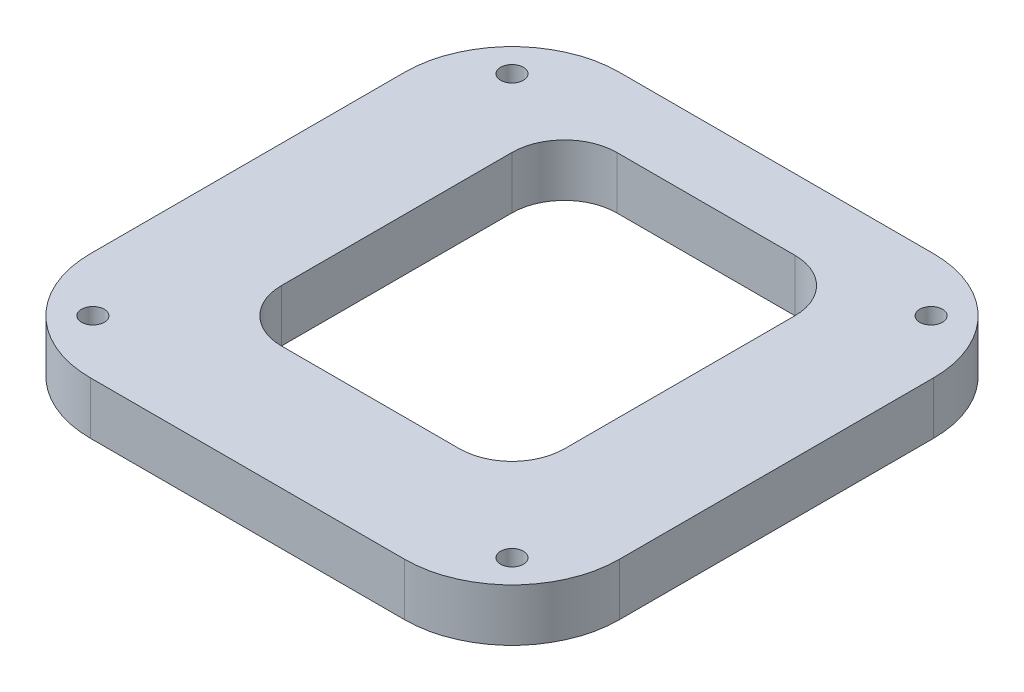
ISO-10303-21;
HEADER;
FILE_DESCRIPTION(('STEP AP214'),'2;1');
FILE_NAME('part.step','',(''),(''),'','','');
FILE_SCHEMA(('AUTOMOTIVE_DESIGN { 1 0 10303 214 1 1 1 1 }'));
ENDSEC;
DATA;
#1=APPLICATION_CONTEXT('core data for automotive mechanical design processes');
#2=APPLICATION_PROTOCOL_DEFINITION('international standard','automotive_design',2000,#1);
#3=PRODUCT_CONTEXT('',#1,'mechanical');
#4=PRODUCT('Part','Part','',(#3));
#5=PRODUCT_RELATED_PRODUCT_CATEGORY('part','',(#4));
#6=PRODUCT_DEFINITION_FORMATION('','',#4);
#7=PRODUCT_DEFINITION_CONTEXT('part definition',#1,'design');
#8=PRODUCT_DEFINITION('design','',#6,#7);
#9=PRODUCT_DEFINITION_SHAPE('','',#8);
#10=(LENGTH_UNIT() NAMED_UNIT(*) SI_UNIT(.MILLI.,.METRE.));
#11=(NAMED_UNIT(*) PLANE_ANGLE_UNIT() SI_UNIT($,.RADIAN.));
#12=(NAMED_UNIT(*) SI_UNIT($,.STERADIAN.) SOLID_ANGLE_UNIT());
#13=UNCERTAINTY_MEASURE_WITH_UNIT(LENGTH_MEASURE(1.E-05),#10,'distance_accuracy_value','');
#14=(GEOMETRIC_REPRESENTATION_CONTEXT(3) GLOBAL_UNCERTAINTY_ASSIGNED_CONTEXT((#13)) GLOBAL_UNIT_ASSIGNED_CONTEXT((#10,
#11,#12)) REPRESENTATION_CONTEXT('',''));
#15=CARTESIAN_POINT('',(0.,0.,0.));
#16=DIRECTION('',(0.,0.,1.));
#17=DIRECTION('',(1.,0.,0.));
#18=AXIS2_PLACEMENT_3D('',#15,#16,#17);
#19=CARTESIAN_POINT('',(0.,10.,0.));
#20=DIRECTION('',(0.,1.,0.));
#21=DIRECTION('',(0.,0.,1.));
#22=AXIS2_PLACEMENT_3D('',#19,#20,#21);
#23=PLANE('',#22);
#24=CARTESIAN_POINT('',(40.,10.,-40.));
#25=DIRECTION('',(0.,1.,0.));
#26=DIRECTION('',(0.,0.,1.));
#27=AXIS2_PLACEMENT_3D('',#24,#25,#26);
#28=CIRCLE('',#27,2.166);
#29=CARTESIAN_POINT('',(40.,10.,-37.834));
#30=VERTEX_POINT('',#29);
#31=EDGE_CURVE('E557',#30,#30,#28,.T.);
#32=ORIENTED_EDGE('',*,*,#31,.F.);
#33=EDGE_LOOP('',(#32));
#34=FACE_BOUND('',#33,.T.);
#35=CARTESIAN_POINT('',(-40.,10.,40.));
#36=DIRECTION('',(0.,1.,0.));
#37=DIRECTION('',(0.,0.,1.));
#38=AXIS2_PLACEMENT_3D('',#35,#36,#37);
#39=CIRCLE('',#38,2.166);
#40=CARTESIAN_POINT('',(-40.,10.,42.166));
#41=VERTEX_POINT('',#40);
#42=EDGE_CURVE('E562',#41,#41,#39,.T.);
#43=ORIENTED_EDGE('',*,*,#42,.F.);
#44=EDGE_LOOP('',(#43));
#45=FACE_BOUND('',#44,.T.);
#46=CARTESIAN_POINT('',(40.,10.,40.));
#47=DIRECTION('',(0.,1.,0.));
#48=DIRECTION('',(0.,0.,1.));
#49=AXIS2_PLACEMENT_3D('',#46,#47,#48);
#50=CIRCLE('',#49,2.166);
#51=CARTESIAN_POINT('',(40.,10.,42.166));
#52=VERTEX_POINT('',#51);
#53=EDGE_CURVE('E573',#52,#52,#50,.T.);
#54=ORIENTED_EDGE('',*,*,#53,.F.);
#55=EDGE_LOOP('',(#54));
#56=FACE_BOUND('',#55,.T.);
#57=CARTESIAN_POINT('',(-40.,10.,-40.));
#58=DIRECTION('',(0.,1.,0.));
#59=DIRECTION('',(0.,0.,1.));
#60=AXIS2_PLACEMENT_3D('',#57,#58,#59);
#61=CIRCLE('',#60,2.166);
#62=CARTESIAN_POINT('',(-40.,10.,-37.834));
#63=VERTEX_POINT('',#62);
#64=EDGE_CURVE('E558',#63,#63,#61,.T.);
#65=ORIENTED_EDGE('',*,*,#64,.F.);
#66=EDGE_LOOP('',(#65));
#67=FACE_BOUND('',#66,.T.);
#68=DIRECTION('',(-1.,0.,0.));
#69=VECTOR('',#68,1.);
#70=CARTESIAN_POINT('',(50.5,10.,-50.5));
#71=LINE('',#70,#69);
#72=CARTESIAN_POINT('',(30.,10.,-50.5));
#73=VERTEX_POINT('',#72);
#74=CARTESIAN_POINT('',(-30.,10.,-50.5));
#75=VERTEX_POINT('',#74);
#76=EDGE_CURVE('E187',#73,#75,#71,.T.);
#77=ORIENTED_EDGE('',*,*,#76,.T.);
#78=CARTESIAN_POINT('',(-30.,10.,-30.));
#79=DIRECTION('',(0.,1.,0.));
#80=DIRECTION('',(0.,0.,1.));
#81=AXIS2_PLACEMENT_3D('',#78,#79,#80);
#82=CIRCLE('',#81,20.5);
#83=CARTESIAN_POINT('',(-50.5,10.,-30.));
#84=VERTEX_POINT('',#83);
#85=EDGE_CURVE('E208',#75,#84,#82,.T.);
#86=ORIENTED_EDGE('',*,*,#85,.T.);
#87=DIRECTION('',(0.,0.,1.));
#88=VECTOR('',#87,1.);
#89=CARTESIAN_POINT('',(-50.5,10.,50.5));
#90=LINE('',#89,#88);
#91=CARTESIAN_POINT('',(-50.5,10.,30.));
#92=VERTEX_POINT('',#91);
#93=EDGE_CURVE('E171',#84,#92,#90,.T.);
#94=ORIENTED_EDGE('',*,*,#93,.T.);
#95=CARTESIAN_POINT('',(-30.,10.,30.));
#96=DIRECTION('',(0.,1.,0.));
#97=DIRECTION('',(0.,0.,1.));
#98=AXIS2_PLACEMENT_3D('',#95,#96,#97);
#99=CIRCLE('',#98,20.5);
#100=CARTESIAN_POINT('',(-30.,10.,50.5));
#101=VERTEX_POINT('',#100);
#102=EDGE_CURVE('E206',#92,#101,#99,.T.);
#103=ORIENTED_EDGE('',*,*,#102,.T.);
#104=DIRECTION('',(1.,0.,0.));
#105=VECTOR('',#104,1.);
#106=CARTESIAN_POINT('',(50.5,10.,50.5));
#107=LINE('',#106,#105);
#108=CARTESIAN_POINT('',(30.,10.,50.5));
#109=VERTEX_POINT('',#108);
#110=EDGE_CURVE('E286',#101,#109,#107,.T.);
#111=ORIENTED_EDGE('',*,*,#110,.T.);
#112=CARTESIAN_POINT('',(30.,10.,30.));
#113=DIRECTION('',(0.,1.,0.));
#114=DIRECTION('',(0.,0.,1.));
#115=AXIS2_PLACEMENT_3D('',#112,#113,#114);
#116=CIRCLE('',#115,20.5);
#117=CARTESIAN_POINT('',(50.5,10.,30.));
#118=VERTEX_POINT('',#117);
#119=EDGE_CURVE('E202',#109,#118,#116,.T.);
#120=ORIENTED_EDGE('',*,*,#119,.T.);
#121=DIRECTION('',(0.,0.,-1.));
#122=VECTOR('',#121,1.);
#123=CARTESIAN_POINT('',(50.5,10.,50.5));
#124=LINE('',#123,#122);
#125=CARTESIAN_POINT('',(50.5,10.,-30.));
#126=VERTEX_POINT('',#125);
#127=EDGE_CURVE('E288',#118,#126,#124,.T.);
#128=ORIENTED_EDGE('',*,*,#127,.T.);
#129=CARTESIAN_POINT('',(30.,10.,-30.));
#130=DIRECTION('',(0.,1.,0.));
#131=DIRECTION('',(0.,0.,1.));
#132=AXIS2_PLACEMENT_3D('',#129,#130,#131);
#133=CIRCLE('',#132,20.5);
#134=EDGE_CURVE('E204',#126,#73,#133,.T.);
#135=ORIENTED_EDGE('',*,*,#134,.T.);
#136=EDGE_LOOP('',(#77,#86,#94,#103,#111,#120,#128,#135));
#137=FACE_BOUND('',#136,.T.);
#138=DIRECTION('',(1.,0.,0.));
#139=VECTOR('',#138,1.);
#140=CARTESIAN_POINT('',(-27.,10.,27.));
#141=LINE('',#140,#139);
#142=CARTESIAN_POINT('',(-17.,10.,27.));
#143=VERTEX_POINT('',#142);
#144=CARTESIAN_POINT('',(17.,10.,27.));
#145=VERTEX_POINT('',#144);
#146=EDGE_CURVE('E577',#143,#145,#141,.T.);
#147=ORIENTED_EDGE('',*,*,#146,.F.);
#148=CARTESIAN_POINT('',(-17.,10.,17.));
#149=DIRECTION('',(0.,1.,0.));
#150=DIRECTION('',(0.,0.,1.));
#151=AXIS2_PLACEMENT_3D('',#148,#149,#150);
#152=CIRCLE('',#151,10.);
#153=CARTESIAN_POINT('',(-27.,10.,17.));
#154=VERTEX_POINT('',#153);
#155=EDGE_CURVE('E245',#143,#154,#152,.F.);
#156=ORIENTED_EDGE('',*,*,#155,.T.);
#157=DIRECTION('',(0.,0.,1.));
#158=VECTOR('',#157,1.);
#159=CARTESIAN_POINT('',(-27.,10.,-37.));
#160=LINE('',#159,#158);
#161=CARTESIAN_POINT('',(-27.,10.,-27.));
#162=VERTEX_POINT('',#161);
#163=EDGE_CURVE('E281',#162,#154,#160,.T.);
#164=ORIENTED_EDGE('',*,*,#163,.F.);
#165=CARTESIAN_POINT('',(-17.,10.,-27.));
#166=DIRECTION('',(0.,1.,0.));
#167=DIRECTION('',(0.,0.,1.));
#168=AXIS2_PLACEMENT_3D('',#165,#166,#167);
#169=CIRCLE('',#168,10.);
#170=CARTESIAN_POINT('',(-17.,10.,-37.));
#171=VERTEX_POINT('',#170);
#172=EDGE_CURVE('E11',#162,#171,#169,.F.);
#173=ORIENTED_EDGE('',*,*,#172,.T.);
#174=DIRECTION('',(-1.,0.,0.));
#175=VECTOR('',#174,1.);
#176=CARTESIAN_POINT('',(-27.,10.,-37.));
#177=LINE('',#176,#175);
#178=CARTESIAN_POINT('',(17.,10.,-37.));
#179=VERTEX_POINT('',#178);
#180=EDGE_CURVE('E179',#179,#171,#177,.T.);
#181=ORIENTED_EDGE('',*,*,#180,.F.);
#182=CARTESIAN_POINT('',(17.,10.,-27.));
#183=DIRECTION('',(0.,1.,0.));
#184=DIRECTION('',(0.,0.,1.));
#185=AXIS2_PLACEMENT_3D('',#182,#183,#184);
#186=CIRCLE('',#185,10.);
#187=CARTESIAN_POINT('',(27.,10.,-27.));
#188=VERTEX_POINT('',#187);
#189=EDGE_CURVE('E249',#179,#188,#186,.F.);
#190=ORIENTED_EDGE('',*,*,#189,.T.);
#191=DIRECTION('',(0.,0.,-1.));
#192=VECTOR('',#191,1.);
#193=CARTESIAN_POINT('',(27.,10.,-37.));
#194=LINE('',#193,#192);
#195=CARTESIAN_POINT('',(27.,10.,17.));
#196=VERTEX_POINT('',#195);
#197=EDGE_CURVE('E184',#196,#188,#194,.T.);
#198=ORIENTED_EDGE('',*,*,#197,.F.);
#199=CARTESIAN_POINT('',(17.,10.,17.));
#200=DIRECTION('',(0.,1.,0.));
#201=DIRECTION('',(0.,0.,1.));
#202=AXIS2_PLACEMENT_3D('',#199,#200,#201);
#203=CIRCLE('',#202,10.);
#204=EDGE_CURVE('E241',#196,#145,#203,.F.);
#205=ORIENTED_EDGE('',*,*,#204,.T.);
#206=EDGE_LOOP('',(#147,#156,#164,#173,#181,#190,#198,#205));
#207=FACE_BOUND('',#206,.T.);
#208=ADVANCED_FACE('F38',(#34,#45,#56,#67,#137,#207),#23,.T.);
#209=CARTESIAN_POINT('',(0.,0.,0.));
#210=DIRECTION('',(0.,1.,0.));
#211=DIRECTION('',(0.,0.,1.));
#212=AXIS2_PLACEMENT_3D('',#209,#210,#211);
#213=PLANE('',#212);
#214=CARTESIAN_POINT('',(40.,0.,-40.));
#215=DIRECTION('',(0.,1.,0.));
#216=DIRECTION('',(0.,0.,1.));
#217=AXIS2_PLACEMENT_3D('',#214,#215,#216);
#218=CIRCLE('',#217,2.166);
#219=CARTESIAN_POINT('',(40.,0.,-37.834));
#220=VERTEX_POINT('',#219);
#221=EDGE_CURVE('E555',#220,#220,#218,.T.);
#222=ORIENTED_EDGE('',*,*,#221,.T.);
#223=EDGE_LOOP('',(#222));
#224=FACE_BOUND('',#223,.T.);
#225=CARTESIAN_POINT('',(-40.,0.,40.));
#226=DIRECTION('',(0.,1.,0.));
#227=DIRECTION('',(0.,0.,1.));
#228=AXIS2_PLACEMENT_3D('',#225,#226,#227);
#229=CIRCLE('',#228,2.166);
#230=CARTESIAN_POINT('',(-40.,0.,42.166));
#231=VERTEX_POINT('',#230);
#232=EDGE_CURVE('E570',#231,#231,#229,.T.);
#233=ORIENTED_EDGE('',*,*,#232,.T.);
#234=EDGE_LOOP('',(#233));
#235=FACE_BOUND('',#234,.T.);
#236=CARTESIAN_POINT('',(40.,0.,40.));
#237=DIRECTION('',(0.,1.,0.));
#238=DIRECTION('',(0.,0.,1.));
#239=AXIS2_PLACEMENT_3D('',#236,#237,#238);
#240=CIRCLE('',#239,2.166);
#241=CARTESIAN_POINT('',(40.,0.,42.166));
#242=VERTEX_POINT('',#241);
#243=EDGE_CURVE('E565',#242,#242,#240,.T.);
#244=ORIENTED_EDGE('',*,*,#243,.T.);
#245=EDGE_LOOP('',(#244));
#246=FACE_BOUND('',#245,.T.);
#247=CARTESIAN_POINT('',(-40.,0.,-40.));
#248=DIRECTION('',(0.,1.,0.));
#249=DIRECTION('',(0.,0.,1.));
#250=AXIS2_PLACEMENT_3D('',#247,#248,#249);
#251=CIRCLE('',#250,2.166);
#252=CARTESIAN_POINT('',(-40.,0.,-37.834));
#253=VERTEX_POINT('',#252);
#254=EDGE_CURVE('E263',#253,#253,#251,.T.);
#255=ORIENTED_EDGE('',*,*,#254,.T.);
#256=EDGE_LOOP('',(#255));
#257=FACE_BOUND('',#256,.T.);
#258=DIRECTION('',(0.,0.,1.));
#259=VECTOR('',#258,1.);
#260=CARTESIAN_POINT('',(-50.5,0.,50.5));
#261=LINE('',#260,#259);
#262=CARTESIAN_POINT('',(-50.5,0.,-30.));
#263=VERTEX_POINT('',#262);
#264=CARTESIAN_POINT('',(-50.5,0.,30.));
#265=VERTEX_POINT('',#264);
#266=EDGE_CURVE('E168',#263,#265,#261,.T.);
#267=ORIENTED_EDGE('',*,*,#266,.F.);
#268=CARTESIAN_POINT('',(-30.,0.,-30.));
#269=DIRECTION('',(0.,1.,0.));
#270=DIRECTION('',(0.,0.,1.));
#271=AXIS2_PLACEMENT_3D('',#268,#269,#270);
#272=CIRCLE('',#271,20.5);
#273=CARTESIAN_POINT('',(-30.,0.,-50.5));
#274=VERTEX_POINT('',#273);
#275=EDGE_CURVE('E151',#263,#274,#272,.F.);
#276=ORIENTED_EDGE('',*,*,#275,.T.);
#277=DIRECTION('',(-1.,0.,0.));
#278=VECTOR('',#277,1.);
#279=CARTESIAN_POINT('',(50.5,0.,-50.5));
#280=LINE('',#279,#278);
#281=CARTESIAN_POINT('',(30.,0.,-50.5));
#282=VERTEX_POINT('',#281);
#283=EDGE_CURVE('E192',#282,#274,#280,.T.);
#284=ORIENTED_EDGE('',*,*,#283,.F.);
#285=CARTESIAN_POINT('',(30.,0.,-30.));
#286=DIRECTION('',(0.,1.,0.));
#287=DIRECTION('',(0.,0.,1.));
#288=AXIS2_PLACEMENT_3D('',#285,#286,#287);
#289=CIRCLE('',#288,20.5);
#290=CARTESIAN_POINT('',(50.5,0.,-30.));
#291=VERTEX_POINT('',#290);
#292=EDGE_CURVE('E196',#282,#291,#289,.F.);
#293=ORIENTED_EDGE('',*,*,#292,.T.);
#294=DIRECTION('',(0.,0.,-1.));
#295=VECTOR('',#294,1.);
#296=CARTESIAN_POINT('',(50.5,0.,50.5));
#297=LINE('',#296,#295);
#298=CARTESIAN_POINT('',(50.5,0.,30.));
#299=VERTEX_POINT('',#298);
#300=EDGE_CURVE('E182',#299,#291,#297,.T.);
#301=ORIENTED_EDGE('',*,*,#300,.F.);
#302=CARTESIAN_POINT('',(30.,0.,30.));
#303=DIRECTION('',(0.,1.,0.));
#304=DIRECTION('',(0.,0.,1.));
#305=AXIS2_PLACEMENT_3D('',#302,#303,#304);
#306=CIRCLE('',#305,20.5);
#307=CARTESIAN_POINT('',(30.,0.,50.5));
#308=VERTEX_POINT('',#307);
#309=EDGE_CURVE('E172',#299,#308,#306,.F.);
#310=ORIENTED_EDGE('',*,*,#309,.T.);
#311=DIRECTION('',(1.,0.,0.));
#312=VECTOR('',#311,1.);
#313=CARTESIAN_POINT('',(50.5,0.,50.5));
#314=LINE('',#313,#312);
#315=CARTESIAN_POINT('',(-30.,0.,50.5));
#316=VERTEX_POINT('',#315);
#317=EDGE_CURVE('E178',#316,#308,#314,.T.);
#318=ORIENTED_EDGE('',*,*,#317,.F.);
#319=CARTESIAN_POINT('',(-30.,0.,30.));
#320=DIRECTION('',(0.,1.,0.));
#321=DIRECTION('',(0.,0.,1.));
#322=AXIS2_PLACEMENT_3D('',#319,#320,#321);
#323=CIRCLE('',#322,20.5);
#324=EDGE_CURVE('E162',#316,#265,#323,.F.);
#325=ORIENTED_EDGE('',*,*,#324,.T.);
#326=EDGE_LOOP('',(#267,#276,#284,#293,#301,#310,#318,#325));
#327=FACE_BOUND('',#326,.T.);
#328=DIRECTION('',(-1.,0.,0.));
#329=VECTOR('',#328,1.);
#330=CARTESIAN_POINT('',(-27.,0.,-37.));
#331=LINE('',#330,#329);
#332=CARTESIAN_POINT('',(17.,0.,-37.));
#333=VERTEX_POINT('',#332);
#334=CARTESIAN_POINT('',(-17.,0.,-37.));
#335=VERTEX_POINT('',#334);
#336=EDGE_CURVE('E254',#333,#335,#331,.T.);
#337=ORIENTED_EDGE('',*,*,#336,.T.);
#338=CARTESIAN_POINT('',(-17.,0.,-27.));
#339=DIRECTION('',(0.,1.,0.));
#340=DIRECTION('',(0.,0.,1.));
#341=AXIS2_PLACEMENT_3D('',#338,#339,#340);
#342=CIRCLE('',#341,10.);
#343=CARTESIAN_POINT('',(-27.,0.,-27.));
#344=VERTEX_POINT('',#343);
#345=EDGE_CURVE('E46',#335,#344,#342,.T.);
#346=ORIENTED_EDGE('',*,*,#345,.T.);
#347=DIRECTION('',(0.,0.,1.));
#348=VECTOR('',#347,1.);
#349=CARTESIAN_POINT('',(-27.,0.,-37.));
#350=LINE('',#349,#348);
#351=CARTESIAN_POINT('',(-27.,0.,17.));
#352=VERTEX_POINT('',#351);
#353=EDGE_CURVE('E253',#344,#352,#350,.T.);
#354=ORIENTED_EDGE('',*,*,#353,.T.);
#355=CARTESIAN_POINT('',(-17.,0.,17.));
#356=DIRECTION('',(0.,1.,0.));
#357=DIRECTION('',(0.,0.,1.));
#358=AXIS2_PLACEMENT_3D('',#355,#356,#357);
#359=CIRCLE('',#358,10.);
#360=CARTESIAN_POINT('',(-17.,0.,27.));
#361=VERTEX_POINT('',#360);
#362=EDGE_CURVE('E243',#352,#361,#359,.T.);
#363=ORIENTED_EDGE('',*,*,#362,.T.);
#364=DIRECTION('',(1.,0.,0.));
#365=VECTOR('',#364,1.);
#366=CARTESIAN_POINT('',(-27.,0.,27.));
#367=LINE('',#366,#365);
#368=CARTESIAN_POINT('',(17.,0.,27.));
#369=VERTEX_POINT('',#368);
#370=EDGE_CURVE('E262',#361,#369,#367,.T.);
#371=ORIENTED_EDGE('',*,*,#370,.T.);
#372=CARTESIAN_POINT('',(17.,0.,17.));
#373=DIRECTION('',(0.,1.,0.));
#374=DIRECTION('',(0.,0.,1.));
#375=AXIS2_PLACEMENT_3D('',#372,#373,#374);
#376=CIRCLE('',#375,10.);
#377=CARTESIAN_POINT('',(27.,0.,17.));
#378=VERTEX_POINT('',#377);
#379=EDGE_CURVE('E239',#369,#378,#376,.T.);
#380=ORIENTED_EDGE('',*,*,#379,.T.);
#381=DIRECTION('',(0.,0.,-1.));
#382=VECTOR('',#381,1.);
#383=CARTESIAN_POINT('',(27.,0.,-37.));
#384=LINE('',#383,#382);
#385=CARTESIAN_POINT('',(27.,0.,-27.));
#386=VERTEX_POINT('',#385);
#387=EDGE_CURVE('E277',#378,#386,#384,.T.);
#388=ORIENTED_EDGE('',*,*,#387,.T.);
#389=CARTESIAN_POINT('',(17.,0.,-27.));
#390=DIRECTION('',(0.,1.,0.));
#391=DIRECTION('',(0.,0.,1.));
#392=AXIS2_PLACEMENT_3D('',#389,#390,#391);
#393=CIRCLE('',#392,10.);
#394=EDGE_CURVE('E247',#386,#333,#393,.T.);
#395=ORIENTED_EDGE('',*,*,#394,.T.);
#396=EDGE_LOOP('',(#337,#346,#354,#363,#371,#380,#388,#395));
#397=FACE_BOUND('',#396,.T.);
#398=ADVANCED_FACE('F175',(#224,#235,#246,#257,#327,#397),#213,.F.);
#399=CARTESIAN_POINT('',(-50.5,10.,50.5));
#400=DIRECTION('',(1.,0.,0.));
#401=DIRECTION('',(0.,0.,-1.));
#402=AXIS2_PLACEMENT_3D('',#399,#400,#401);
#403=PLANE('',#402);
#404=ORIENTED_EDGE('',*,*,#93,.F.);
#405=DIRECTION('',(0.,-1.,0.));
#406=VECTOR('',#405,1.);
#407=CARTESIAN_POINT('',(-50.5,10.,-30.));
#408=LINE('',#407,#406);
#409=EDGE_CURVE('E155',#84,#263,#408,.T.);
#410=ORIENTED_EDGE('',*,*,#409,.T.);
#411=ORIENTED_EDGE('',*,*,#266,.T.);
#412=DIRECTION('',(0.,-1.,0.));
#413=VECTOR('',#412,1.);
#414=CARTESIAN_POINT('',(-50.5,10.,30.));
#415=LINE('',#414,#413);
#416=EDGE_CURVE('E173',#265,#92,#415,.F.);
#417=ORIENTED_EDGE('',*,*,#416,.T.);
#418=EDGE_LOOP('',(#404,#410,#411,#417));
#419=FACE_BOUND('',#418,.T.);
#420=ADVANCED_FACE('F167',(#419),#403,.F.);
#421=CARTESIAN_POINT('',(50.5,10.,50.5));
#422=DIRECTION('',(0.,0.,-1.));
#423=DIRECTION('',(-1.,0.,0.));
#424=AXIS2_PLACEMENT_3D('',#421,#422,#423);
#425=PLANE('',#424);
#426=ORIENTED_EDGE('',*,*,#110,.F.);
#427=DIRECTION('',(0.,-1.,0.));
#428=VECTOR('',#427,1.);
#429=CARTESIAN_POINT('',(-30.,10.,50.5));
#430=LINE('',#429,#428);
#431=EDGE_CURVE('E212',#101,#316,#430,.T.);
#432=ORIENTED_EDGE('',*,*,#431,.T.);
#433=ORIENTED_EDGE('',*,*,#317,.T.);
#434=DIRECTION('',(0.,-1.,0.));
#435=VECTOR('',#434,1.);
#436=CARTESIAN_POINT('',(30.,10.,50.5));
#437=LINE('',#436,#435);
#438=EDGE_CURVE('E210',#308,#109,#437,.F.);
#439=ORIENTED_EDGE('',*,*,#438,.T.);
#440=EDGE_LOOP('',(#426,#432,#433,#439));
#441=FACE_BOUND('',#440,.T.);
#442=ADVANCED_FACE('F311',(#441),#425,.F.);
#443=CARTESIAN_POINT('',(50.5,10.,50.5));
#444=DIRECTION('',(-1.,0.,0.));
#445=DIRECTION('',(0.,0.,1.));
#446=AXIS2_PLACEMENT_3D('',#443,#444,#445);
#447=PLANE('',#446);
#448=ORIENTED_EDGE('',*,*,#300,.T.);
#449=DIRECTION('',(0.,-1.,0.));
#450=VECTOR('',#449,1.);
#451=CARTESIAN_POINT('',(50.5,10.,-30.));
#452=LINE('',#451,#450);
#453=EDGE_CURVE('E218',#291,#126,#452,.F.);
#454=ORIENTED_EDGE('',*,*,#453,.T.);
#455=ORIENTED_EDGE('',*,*,#127,.F.);
#456=DIRECTION('',(0.,-1.,0.));
#457=VECTOR('',#456,1.);
#458=CARTESIAN_POINT('',(50.5,10.,30.));
#459=LINE('',#458,#457);
#460=EDGE_CURVE('E215',#118,#299,#459,.T.);
#461=ORIENTED_EDGE('',*,*,#460,.T.);
#462=EDGE_LOOP('',(#448,#454,#455,#461));
#463=FACE_BOUND('',#462,.T.);
#464=ADVANCED_FACE('F303',(#463),#447,.F.);
#465=CARTESIAN_POINT('',(50.5,10.,-50.5));
#466=DIRECTION('',(0.,0.,1.));
#467=DIRECTION('',(1.,0.,0.));
#468=AXIS2_PLACEMENT_3D('',#465,#466,#467);
#469=PLANE('',#468);
#470=ORIENTED_EDGE('',*,*,#283,.T.);
#471=DIRECTION('',(0.,-1.,0.));
#472=VECTOR('',#471,1.);
#473=CARTESIAN_POINT('',(-30.,10.,-50.5));
#474=LINE('',#473,#472);
#475=EDGE_CURVE('E156',#274,#75,#474,.F.);
#476=ORIENTED_EDGE('',*,*,#475,.T.);
#477=ORIENTED_EDGE('',*,*,#76,.F.);
#478=DIRECTION('',(0.,-1.,0.));
#479=VECTOR('',#478,1.);
#480=CARTESIAN_POINT('',(30.,10.,-50.5));
#481=LINE('',#480,#479);
#482=EDGE_CURVE('E161',#73,#282,#481,.T.);
#483=ORIENTED_EDGE('',*,*,#482,.T.);
#484=EDGE_LOOP('',(#470,#476,#477,#483));
#485=FACE_BOUND('',#484,.T.);
#486=ADVANCED_FACE('F297',(#485),#469,.F.);
#487=CARTESIAN_POINT('',(-27.,10.,-37.));
#488=DIRECTION('',(1.,0.,0.));
#489=DIRECTION('',(0.,0.,-1.));
#490=AXIS2_PLACEMENT_3D('',#487,#488,#489);
#491=PLANE('',#490);
#492=ORIENTED_EDGE('',*,*,#163,.T.);
#493=DIRECTION('',(0.,-1.,0.));
#494=VECTOR('',#493,1.);
#495=CARTESIAN_POINT('',(-27.,0.,17.));
#496=LINE('',#495,#494);
#497=EDGE_CURVE('E232',#154,#352,#496,.T.);
#498=ORIENTED_EDGE('',*,*,#497,.T.);
#499=ORIENTED_EDGE('',*,*,#353,.F.);
#500=DIRECTION('',(0.,-1.,0.));
#501=VECTOR('',#500,1.);
#502=CARTESIAN_POINT('',(-27.,10.,-27.));
#503=LINE('',#502,#501);
#504=EDGE_CURVE('E230',#344,#162,#503,.F.);
#505=ORIENTED_EDGE('',*,*,#504,.T.);
#506=EDGE_LOOP('',(#492,#498,#499,#505));
#507=FACE_BOUND('',#506,.T.);
#508=ADVANCED_FACE('F260',(#507),#491,.T.);
#509=CARTESIAN_POINT('',(-27.,10.,27.));
#510=DIRECTION('',(0.,0.,-1.));
#511=DIRECTION('',(-1.,0.,0.));
#512=AXIS2_PLACEMENT_3D('',#509,#510,#511);
#513=PLANE('',#512);
#514=ORIENTED_EDGE('',*,*,#146,.T.);
#515=DIRECTION('',(0.,-1.,0.));
#516=VECTOR('',#515,1.);
#517=CARTESIAN_POINT('',(17.,0.,27.));
#518=LINE('',#517,#516);
#519=EDGE_CURVE('E222',#145,#369,#518,.T.);
#520=ORIENTED_EDGE('',*,*,#519,.T.);
#521=ORIENTED_EDGE('',*,*,#370,.F.);
#522=DIRECTION('',(0.,-1.,0.));
#523=VECTOR('',#522,1.);
#524=CARTESIAN_POINT('',(-17.,10.,27.));
#525=LINE('',#524,#523);
#526=EDGE_CURVE('E220',#361,#143,#525,.F.);
#527=ORIENTED_EDGE('',*,*,#526,.T.);
#528=EDGE_LOOP('',(#514,#520,#521,#527));
#529=FACE_BOUND('',#528,.T.);
#530=ADVANCED_FACE('F367',(#529),#513,.T.);
#531=CARTESIAN_POINT('',(27.,10.,-37.));
#532=DIRECTION('',(-1.,0.,0.));
#533=DIRECTION('',(0.,0.,1.));
#534=AXIS2_PLACEMENT_3D('',#531,#532,#533);
#535=PLANE('',#534);
#536=ORIENTED_EDGE('',*,*,#387,.F.);
#537=DIRECTION('',(0.,-1.,0.));
#538=VECTOR('',#537,1.);
#539=CARTESIAN_POINT('',(27.,10.,17.));
#540=LINE('',#539,#538);
#541=EDGE_CURVE('E228',#378,#196,#540,.F.);
#542=ORIENTED_EDGE('',*,*,#541,.T.);
#543=ORIENTED_EDGE('',*,*,#197,.T.);
#544=DIRECTION('',(0.,-1.,0.));
#545=VECTOR('',#544,1.);
#546=CARTESIAN_POINT('',(27.,0.,-27.));
#547=LINE('',#546,#545);
#548=EDGE_CURVE('E225',#188,#386,#547,.T.);
#549=ORIENTED_EDGE('',*,*,#548,.T.);
#550=EDGE_LOOP('',(#536,#542,#543,#549));
#551=FACE_BOUND('',#550,.T.);
#552=ADVANCED_FACE('F276',(#551),#535,.T.);
#553=CARTESIAN_POINT('',(-27.,10.,-37.));
#554=DIRECTION('',(0.,0.,1.));
#555=DIRECTION('',(1.,0.,0.));
#556=AXIS2_PLACEMENT_3D('',#553,#554,#555);
#557=PLANE('',#556);
#558=ORIENTED_EDGE('',*,*,#336,.F.);
#559=DIRECTION('',(0.,-1.,0.));
#560=VECTOR('',#559,1.);
#561=CARTESIAN_POINT('',(17.,10.,-37.));
#562=LINE('',#561,#560);
#563=EDGE_CURVE('E58',#333,#179,#562,.F.);
#564=ORIENTED_EDGE('',*,*,#563,.T.);
#565=ORIENTED_EDGE('',*,*,#180,.T.);
#566=DIRECTION('',(0.,-1.,0.));
#567=VECTOR('',#566,1.);
#568=CARTESIAN_POINT('',(-17.,0.,-37.));
#569=LINE('',#568,#567);
#570=EDGE_CURVE('E235',#171,#335,#569,.T.);
#571=ORIENTED_EDGE('',*,*,#570,.T.);
#572=EDGE_LOOP('',(#558,#564,#565,#571));
#573=FACE_BOUND('',#572,.T.);
#574=ADVANCED_FACE('F265',(#573),#557,.T.);
#575=CARTESIAN_POINT('',(-30.,10.,-30.));
#576=DIRECTION('',(0.,-1.,0.));
#577=DIRECTION('',(0.,0.,-1.));
#578=AXIS2_PLACEMENT_3D('',#575,#576,#577);
#579=CYLINDRICAL_SURFACE('',#578,20.5);
#580=ORIENTED_EDGE('',*,*,#85,.F.);
#581=ORIENTED_EDGE('',*,*,#475,.F.);
#582=ORIENTED_EDGE('',*,*,#275,.F.);
#583=ORIENTED_EDGE('',*,*,#409,.F.);
#584=EDGE_LOOP('',(#580,#581,#582,#583));
#585=FACE_BOUND('',#584,.T.);
#586=ADVANCED_FACE('F154',(#585),#579,.T.);
#587=CARTESIAN_POINT('',(-30.,10.,30.));
#588=DIRECTION('',(0.,-1.,0.));
#589=DIRECTION('',(0.,0.,-1.));
#590=AXIS2_PLACEMENT_3D('',#587,#588,#589);
#591=CYLINDRICAL_SURFACE('',#590,20.5);
#592=ORIENTED_EDGE('',*,*,#102,.F.);
#593=ORIENTED_EDGE('',*,*,#416,.F.);
#594=ORIENTED_EDGE('',*,*,#324,.F.);
#595=ORIENTED_EDGE('',*,*,#431,.F.);
#596=EDGE_LOOP('',(#592,#593,#594,#595));
#597=FACE_BOUND('',#596,.T.);
#598=ADVANCED_FACE('F315',(#597),#591,.T.);
#599=CARTESIAN_POINT('',(30.,10.,-30.));
#600=DIRECTION('',(0.,-1.,0.));
#601=DIRECTION('',(0.,0.,-1.));
#602=AXIS2_PLACEMENT_3D('',#599,#600,#601);
#603=CYLINDRICAL_SURFACE('',#602,20.5);
#604=ORIENTED_EDGE('',*,*,#134,.F.);
#605=ORIENTED_EDGE('',*,*,#453,.F.);
#606=ORIENTED_EDGE('',*,*,#292,.F.);
#607=ORIENTED_EDGE('',*,*,#482,.F.);
#608=EDGE_LOOP('',(#604,#605,#606,#607));
#609=FACE_BOUND('',#608,.T.);
#610=ADVANCED_FACE('F299',(#609),#603,.T.);
#611=CARTESIAN_POINT('',(30.,10.,30.));
#612=DIRECTION('',(0.,-1.,0.));
#613=DIRECTION('',(0.,0.,-1.));
#614=AXIS2_PLACEMENT_3D('',#611,#612,#613);
#615=CYLINDRICAL_SURFACE('',#614,20.5);
#616=ORIENTED_EDGE('',*,*,#119,.F.);
#617=ORIENTED_EDGE('',*,*,#438,.F.);
#618=ORIENTED_EDGE('',*,*,#309,.F.);
#619=ORIENTED_EDGE('',*,*,#460,.F.);
#620=EDGE_LOOP('',(#616,#617,#618,#619));
#621=FACE_BOUND('',#620,.T.);
#622=ADVANCED_FACE('F307',(#621),#615,.T.);
#623=CARTESIAN_POINT('',(17.,10.,17.));
#624=DIRECTION('',(0.,1.,0.));
#625=DIRECTION('',(0.,0.,1.));
#626=AXIS2_PLACEMENT_3D('',#623,#624,#625);
#627=CYLINDRICAL_SURFACE('',#626,10.);
#628=ORIENTED_EDGE('',*,*,#204,.F.);
#629=ORIENTED_EDGE('',*,*,#541,.F.);
#630=ORIENTED_EDGE('',*,*,#379,.F.);
#631=ORIENTED_EDGE('',*,*,#519,.F.);
#632=EDGE_LOOP('',(#628,#629,#630,#631));
#633=FACE_BOUND('',#632,.T.);
#634=ADVANCED_FACE('F410',(#633),#627,.F.);
#635=CARTESIAN_POINT('',(-17.,10.,17.));
#636=DIRECTION('',(0.,1.,0.));
#637=DIRECTION('',(0.,0.,1.));
#638=AXIS2_PLACEMENT_3D('',#635,#636,#637);
#639=CYLINDRICAL_SURFACE('',#638,10.);
#640=ORIENTED_EDGE('',*,*,#155,.F.);
#641=ORIENTED_EDGE('',*,*,#526,.F.);
#642=ORIENTED_EDGE('',*,*,#362,.F.);
#643=ORIENTED_EDGE('',*,*,#497,.F.);
#644=EDGE_LOOP('',(#640,#641,#642,#643));
#645=FACE_BOUND('',#644,.T.);
#646=ADVANCED_FACE('F420',(#645),#639,.F.);
#647=CARTESIAN_POINT('',(17.,10.,-27.));
#648=DIRECTION('',(0.,1.,0.));
#649=DIRECTION('',(0.,0.,1.));
#650=AXIS2_PLACEMENT_3D('',#647,#648,#649);
#651=CYLINDRICAL_SURFACE('',#650,10.);
#652=ORIENTED_EDGE('',*,*,#189,.F.);
#653=ORIENTED_EDGE('',*,*,#563,.F.);
#654=ORIENTED_EDGE('',*,*,#394,.F.);
#655=ORIENTED_EDGE('',*,*,#548,.F.);
#656=EDGE_LOOP('',(#652,#653,#654,#655));
#657=FACE_BOUND('',#656,.T.);
#658=ADVANCED_FACE('F272',(#657),#651,.F.);
#659=CARTESIAN_POINT('',(-17.,10.,-27.));
#660=DIRECTION('',(0.,1.,0.));
#661=DIRECTION('',(0.,0.,1.));
#662=AXIS2_PLACEMENT_3D('',#659,#660,#661);
#663=CYLINDRICAL_SURFACE('',#662,10.);
#664=ORIENTED_EDGE('',*,*,#172,.F.);
#665=ORIENTED_EDGE('',*,*,#504,.F.);
#666=ORIENTED_EDGE('',*,*,#345,.F.);
#667=ORIENTED_EDGE('',*,*,#570,.F.);
#668=EDGE_LOOP('',(#664,#665,#666,#667));
#669=FACE_BOUND('',#668,.T.);
#670=ADVANCED_FACE('F40',(#669),#663,.F.);
#671=CARTESIAN_POINT('',(-40.,0.,-40.));
#672=DIRECTION('',(0.,1.,0.));
#673=DIRECTION('',(0.,0.,1.));
#674=AXIS2_PLACEMENT_3D('',#671,#672,#673);
#675=CYLINDRICAL_SURFACE('',#674,2.166);
#676=ORIENTED_EDGE('',*,*,#254,.F.);
#677=EDGE_LOOP('',(#676));
#678=FACE_BOUND('',#677,.T.);
#679=ORIENTED_EDGE('',*,*,#64,.T.);
#680=EDGE_LOOP('',(#679));
#681=FACE_BOUND('',#680,.T.);
#682=ADVANCED_FACE('F439',(#678,#681),#675,.F.);
#683=CARTESIAN_POINT('',(40.,0.,40.));
#684=DIRECTION('',(0.,1.,0.));
#685=DIRECTION('',(0.,0.,1.));
#686=AXIS2_PLACEMENT_3D('',#683,#684,#685);
#687=CYLINDRICAL_SURFACE('',#686,2.166);
#688=ORIENTED_EDGE('',*,*,#243,.F.);
#689=EDGE_LOOP('',(#688));
#690=FACE_BOUND('',#689,.T.);
#691=ORIENTED_EDGE('',*,*,#53,.T.);
#692=EDGE_LOOP('',(#691));
#693=FACE_BOUND('',#692,.T.);
#694=ADVANCED_FACE('F445',(#690,#693),#687,.F.);
#695=CARTESIAN_POINT('',(-40.,0.,40.));
#696=DIRECTION('',(0.,1.,0.));
#697=DIRECTION('',(0.,0.,1.));
#698=AXIS2_PLACEMENT_3D('',#695,#696,#697);
#699=CYLINDRICAL_SURFACE('',#698,2.166);
#700=ORIENTED_EDGE('',*,*,#232,.F.);
#701=EDGE_LOOP('',(#700));
#702=FACE_BOUND('',#701,.T.);
#703=ORIENTED_EDGE('',*,*,#42,.T.);
#704=EDGE_LOOP('',(#703));
#705=FACE_BOUND('',#704,.T.);
#706=ADVANCED_FACE('F453',(#702,#705),#699,.F.);
#707=CARTESIAN_POINT('',(40.,0.,-40.));
#708=DIRECTION('',(0.,1.,0.));
#709=DIRECTION('',(0.,0.,1.));
#710=AXIS2_PLACEMENT_3D('',#707,#708,#709);
#711=CYLINDRICAL_SURFACE('',#710,2.166);
#712=ORIENTED_EDGE('',*,*,#221,.F.);
#713=EDGE_LOOP('',(#712));
#714=FACE_BOUND('',#713,.T.);
#715=ORIENTED_EDGE('',*,*,#31,.T.);
#716=EDGE_LOOP('',(#715));
#717=FACE_BOUND('',#716,.T.);
#718=ADVANCED_FACE('F461',(#714,#717),#711,.F.);
#719=CLOSED_SHELL('',(#208,#398,#420,#442,#464,#486,#508,#530,#552,#574,#586,#598,#610,#622,
#634,#646,#658,#670,#682,#694,#706,#718));
#720=MANIFOLD_SOLID_BREP('B2',#719);
#721=ADVANCED_BREP_SHAPE_REPRESENTATION('',(#18,#720),#14);
#722=SHAPE_DEFINITION_REPRESENTATION(#9,#721);
ENDSEC;
END-ISO-10303-21;
